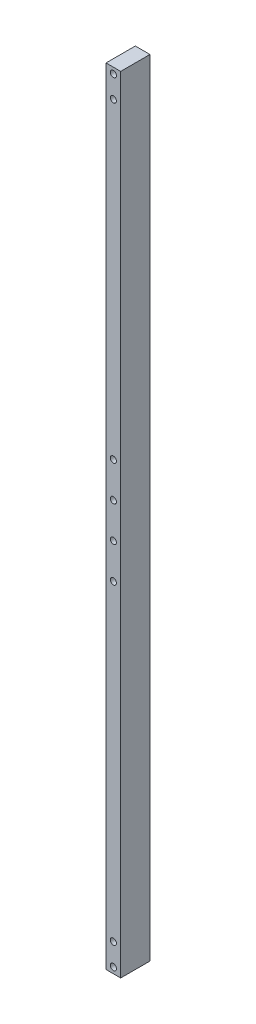
ISO-10303-21;
HEADER;
FILE_DESCRIPTION(('STEP AP214'),'2;1');
FILE_NAME('part.step','',(''),(''),'','','');
FILE_SCHEMA(('AUTOMOTIVE_DESIGN { 1 0 10303 214 1 1 1 1 }'));
ENDSEC;
DATA;
#1=APPLICATION_CONTEXT('core data for automotive mechanical design processes');
#2=APPLICATION_PROTOCOL_DEFINITION('international standard','automotive_design',2000,#1);
#3=PRODUCT_CONTEXT('',#1,'mechanical');
#4=PRODUCT('Part','Part','',(#3));
#5=PRODUCT_RELATED_PRODUCT_CATEGORY('part','',(#4));
#6=PRODUCT_DEFINITION_FORMATION('','',#4);
#7=PRODUCT_DEFINITION_CONTEXT('part definition',#1,'design');
#8=PRODUCT_DEFINITION('design','',#6,#7);
#9=PRODUCT_DEFINITION_SHAPE('','',#8);
#10=(LENGTH_UNIT() NAMED_UNIT(*) SI_UNIT(.MILLI.,.METRE.));
#11=(NAMED_UNIT(*) PLANE_ANGLE_UNIT() SI_UNIT($,.RADIAN.));
#12=(NAMED_UNIT(*) SI_UNIT($,.STERADIAN.) SOLID_ANGLE_UNIT());
#13=UNCERTAINTY_MEASURE_WITH_UNIT(LENGTH_MEASURE(1.E-05),#10,'distance_accuracy_value','');
#14=(GEOMETRIC_REPRESENTATION_CONTEXT(3) GLOBAL_UNCERTAINTY_ASSIGNED_CONTEXT((#13)) GLOBAL_UNIT_ASSIGNED_CONTEXT((#10,
#11,#12)) REPRESENTATION_CONTEXT('',''));
#15=CARTESIAN_POINT('',(0.,0.,0.));
#16=DIRECTION('',(0.,0.,1.));
#17=DIRECTION('',(1.,0.,0.));
#18=AXIS2_PLACEMENT_3D('',#15,#16,#17);
#19=CARTESIAN_POINT('',(-3.09278350515464,600.,-14.819587628866));
#20=DIRECTION('',(1.,0.,0.));
#21=DIRECTION('',(0.,0.,-1.));
#22=AXIS2_PLACEMENT_3D('',#19,#20,#21);
#23=PLANE('',#22);
#24=DIRECTION('',(0.,-1.,0.));
#25=VECTOR('',#24,1.);
#26=CARTESIAN_POINT('',(-3.09278350515464,600.,-14.819587628866));
#27=LINE('',#26,#25);
#28=CARTESIAN_POINT('',(-3.09278350515464,568.,-14.819587628866));
#29=VERTEX_POINT('',#28);
#30=CARTESIAN_POINT('',(-3.09278350515464,32.,-14.819587628866));
#31=VERTEX_POINT('',#30);
#32=EDGE_CURVE('E95',#29,#31,#27,.T.);
#33=ORIENTED_EDGE('',*,*,#32,.T.);
#34=DIRECTION('',(0.,0.,1.));
#35=VECTOR('',#34,1.);
#36=CARTESIAN_POINT('',(-3.09278350515464,32.,-14.819587628866));
#37=LINE('',#36,#35);
#38=CARTESIAN_POINT('',(-3.09278350515464,32.,5.18041237113402));
#39=VERTEX_POINT('',#38);
#40=EDGE_CURVE('E52',#31,#39,#37,.T.);
#41=ORIENTED_EDGE('',*,*,#40,.T.);
#42=DIRECTION('',(0.,-1.,0.));
#43=VECTOR('',#42,1.);
#44=CARTESIAN_POINT('',(-3.09278350515464,600.,5.18041237113402));
#45=LINE('',#44,#43);
#46=CARTESIAN_POINT('',(-3.09278350515464,568.,5.18041237113402));
#47=VERTEX_POINT('',#46);
#48=EDGE_CURVE('E11',#47,#39,#45,.T.);
#49=ORIENTED_EDGE('',*,*,#48,.F.);
#50=DIRECTION('',(0.,0.,1.));
#51=VECTOR('',#50,1.);
#52=CARTESIAN_POINT('',(-3.09278350515464,568.,-14.819587628866));
#53=LINE('',#52,#51);
#54=EDGE_CURVE('E282',#29,#47,#53,.T.);
#55=ORIENTED_EDGE('',*,*,#54,.F.);
#56=EDGE_LOOP('',(#33,#41,#49,#55));
#57=FACE_BOUND('',#56,.T.);
#58=ADVANCED_FACE('F36',(#57),#23,.F.);
#59=CARTESIAN_POINT('',(-3.09278350515464,600.,5.18041237113402));
#60=DIRECTION('',(0.,0.,-1.));
#61=DIRECTION('',(-1.,0.,0.));
#62=AXIS2_PLACEMENT_3D('',#59,#60,#61);
#63=PLANE('',#62);
#64=CARTESIAN_POINT('',(1.90721649484537,549.,5.18041237113402));
#65=DIRECTION('',(0.,0.,1.));
#66=DIRECTION('',(1.,0.,0.));
#67=AXIS2_PLACEMENT_3D('',#64,#65,#66);
#68=CIRCLE('',#67,2.10000000000005);
#69=CARTESIAN_POINT('',(4.00721649484541,549.,5.18041237113402));
#70=VERTEX_POINT('',#69);
#71=EDGE_CURVE('E293',#70,#70,#68,.T.);
#72=ORIENTED_EDGE('',*,*,#71,.F.);
#73=EDGE_LOOP('',(#72));
#74=FACE_BOUND('',#73,.T.);
#75=CARTESIAN_POINT('',(1.90721649484543,36.,5.18041237113402));
#76=DIRECTION('',(0.,0.,1.));
#77=DIRECTION('',(-1.,0.,0.));
#78=AXIS2_PLACEMENT_3D('',#75,#76,#77);
#79=CIRCLE('',#78,2.10000000000002);
#80=CARTESIAN_POINT('',(-0.192783505154585,36.,5.18041237113402));
#81=VERTEX_POINT('',#80);
#82=EDGE_CURVE('E292',#81,#81,#79,.T.);
#83=ORIENTED_EDGE('',*,*,#82,.F.);
#84=EDGE_LOOP('',(#83));
#85=FACE_BOUND('',#84,.T.);
#86=CARTESIAN_POINT('',(1.90721649484543,51.,5.18041237113402));
#87=DIRECTION('',(0.,0.,1.));
#88=DIRECTION('',(-1.,0.,0.));
#89=AXIS2_PLACEMENT_3D('',#86,#87,#88);
#90=CIRCLE('',#89,2.1);
#91=CARTESIAN_POINT('',(-0.192783505154569,51.,5.18041237113402));
#92=VERTEX_POINT('',#91);
#93=EDGE_CURVE('E289',#92,#92,#90,.T.);
#94=ORIENTED_EDGE('',*,*,#93,.F.);
#95=EDGE_LOOP('',(#94));
#96=FACE_BOUND('',#95,.T.);
#97=CARTESIAN_POINT('',(1.90721649484537,564.,5.18041237113402));
#98=DIRECTION('',(0.,0.,1.));
#99=DIRECTION('',(1.,0.,0.));
#100=AXIS2_PLACEMENT_3D('',#97,#98,#99);
#101=CIRCLE('',#100,2.10000000000006);
#102=CARTESIAN_POINT('',(4.00721649484542,564.,5.18041237113402));
#103=VERTEX_POINT('',#102);
#104=EDGE_CURVE('E103',#103,#103,#101,.T.);
#105=ORIENTED_EDGE('',*,*,#104,.F.);
#106=EDGE_LOOP('',(#105));
#107=FACE_BOUND('',#106,.T.);
#108=CARTESIAN_POINT('',(1.9072164948454,264.,5.18041237113402));
#109=DIRECTION('',(0.,0.,1.));
#110=DIRECTION('',(1.,0.,0.));
#111=AXIS2_PLACEMENT_3D('',#108,#109,#110);
#112=CIRCLE('',#111,2.09999999999999);
#113=CARTESIAN_POINT('',(4.0072164948454,264.,5.18041237113402));
#114=VERTEX_POINT('',#113);
#115=EDGE_CURVE('E128',#114,#114,#112,.T.);
#116=ORIENTED_EDGE('',*,*,#115,.F.);
#117=EDGE_LOOP('',(#116));
#118=FACE_BOUND('',#117,.T.);
#119=CARTESIAN_POINT('',(1.9072164948454,288.,5.18041237113402));
#120=DIRECTION('',(0.,0.,1.));
#121=DIRECTION('',(1.,0.,0.));
#122=AXIS2_PLACEMENT_3D('',#119,#120,#121);
#123=CIRCLE('',#122,2.1);
#124=CARTESIAN_POINT('',(4.0072164948454,288.,5.18041237113402));
#125=VERTEX_POINT('',#124);
#126=EDGE_CURVE('E140',#125,#125,#123,.T.);
#127=ORIENTED_EDGE('',*,*,#126,.F.);
#128=EDGE_LOOP('',(#127));
#129=FACE_BOUND('',#128,.T.);
#130=CARTESIAN_POINT('',(1.9072164948454,312.,5.18041237113402));
#131=DIRECTION('',(0.,0.,1.));
#132=DIRECTION('',(-1.,0.,0.));
#133=AXIS2_PLACEMENT_3D('',#130,#131,#132);
#134=CIRCLE('',#133,2.09999999999999);
#135=CARTESIAN_POINT('',(-0.192783505154593,312.,5.18041237113402));
#136=VERTEX_POINT('',#135);
#137=EDGE_CURVE('E119',#136,#136,#134,.T.);
#138=ORIENTED_EDGE('',*,*,#137,.F.);
#139=EDGE_LOOP('',(#138));
#140=FACE_BOUND('',#139,.T.);
#141=CARTESIAN_POINT('',(1.9072164948454,336.,5.18041237113402));
#142=DIRECTION('',(0.,0.,1.));
#143=DIRECTION('',(-1.,0.,0.));
#144=AXIS2_PLACEMENT_3D('',#141,#142,#143);
#145=CIRCLE('',#144,2.09999999999999);
#146=CARTESIAN_POINT('',(-0.19278350515459,336.,5.18041237113402));
#147=VERTEX_POINT('',#146);
#148=EDGE_CURVE('E110',#147,#147,#145,.T.);
#149=ORIENTED_EDGE('',*,*,#148,.F.);
#150=EDGE_LOOP('',(#149));
#151=FACE_BOUND('',#150,.T.);
#152=ORIENTED_EDGE('',*,*,#48,.T.);
#153=DIRECTION('',(-1.,0.,0.));
#154=VECTOR('',#153,1.);
#155=CARTESIAN_POINT('',(6.90721649484536,32.,5.18041237113402));
#156=LINE('',#155,#154);
#157=CARTESIAN_POINT('',(6.90721649484536,32.,5.18041237113402));
#158=VERTEX_POINT('',#157);
#159=EDGE_CURVE('E79',#158,#39,#156,.T.);
#160=ORIENTED_EDGE('',*,*,#159,.F.);
#161=DIRECTION('',(0.,-1.,0.));
#162=VECTOR('',#161,1.);
#163=CARTESIAN_POINT('',(6.90721649484536,600.,5.18041237113402));
#164=LINE('',#163,#162);
#165=CARTESIAN_POINT('',(6.90721649484536,568.,5.18041237113402));
#166=VERTEX_POINT('',#165);
#167=EDGE_CURVE('E44',#166,#158,#164,.T.);
#168=ORIENTED_EDGE('',*,*,#167,.F.);
#169=DIRECTION('',(1.,0.,0.));
#170=VECTOR('',#169,1.);
#171=CARTESIAN_POINT('',(6.90721649484536,568.,5.18041237113402));
#172=LINE('',#171,#170);
#173=EDGE_CURVE('E281',#47,#166,#172,.T.);
#174=ORIENTED_EDGE('',*,*,#173,.F.);
#175=EDGE_LOOP('',(#152,#160,#168,#174));
#176=FACE_BOUND('',#175,.T.);
#177=ADVANCED_FACE('F88',(#74,#85,#96,#107,#118,#129,#140,#151,#176),#63,.F.);
#178=CARTESIAN_POINT('',(6.90721649484536,600.,-14.819587628866));
#179=DIRECTION('',(-1.,0.,0.));
#180=DIRECTION('',(0.,0.,1.));
#181=AXIS2_PLACEMENT_3D('',#178,#179,#180);
#182=PLANE('',#181);
#183=ORIENTED_EDGE('',*,*,#167,.T.);
#184=DIRECTION('',(0.,0.,1.));
#185=VECTOR('',#184,1.);
#186=CARTESIAN_POINT('',(6.90721649484536,32.,-14.819587628866));
#187=LINE('',#186,#185);
#188=CARTESIAN_POINT('',(6.90721649484536,32.,-14.819587628866));
#189=VERTEX_POINT('',#188);
#190=EDGE_CURVE('E76',#189,#158,#187,.T.);
#191=ORIENTED_EDGE('',*,*,#190,.F.);
#192=DIRECTION('',(0.,-1.,0.));
#193=VECTOR('',#192,1.);
#194=CARTESIAN_POINT('',(6.90721649484536,600.,-14.819587628866));
#195=LINE('',#194,#193);
#196=CARTESIAN_POINT('',(6.90721649484536,568.,-14.819587628866));
#197=VERTEX_POINT('',#196);
#198=EDGE_CURVE('E93',#197,#189,#195,.T.);
#199=ORIENTED_EDGE('',*,*,#198,.F.);
#200=DIRECTION('',(0.,0.,1.));
#201=VECTOR('',#200,1.);
#202=CARTESIAN_POINT('',(6.90721649484536,568.,-14.819587628866));
#203=LINE('',#202,#201);
#204=EDGE_CURVE('E60',#197,#166,#203,.T.);
#205=ORIENTED_EDGE('',*,*,#204,.T.);
#206=EDGE_LOOP('',(#183,#191,#199,#205));
#207=FACE_BOUND('',#206,.T.);
#208=ADVANCED_FACE('F92',(#207),#182,.F.);
#209=CARTESIAN_POINT('',(-3.09278350515464,600.,-14.819587628866));
#210=DIRECTION('',(0.,0.,1.));
#211=DIRECTION('',(1.,0.,0.));
#212=AXIS2_PLACEMENT_3D('',#209,#210,#211);
#213=PLANE('',#212);
#214=CARTESIAN_POINT('',(1.90721649484537,549.,-14.819587628866));
#215=DIRECTION('',(0.,0.,1.));
#216=DIRECTION('',(1.,0.,0.));
#217=AXIS2_PLACEMENT_3D('',#214,#215,#216);
#218=CIRCLE('',#217,2.10000000000005);
#219=CARTESIAN_POINT('',(4.00721649484541,549.,-14.819587628866));
#220=VERTEX_POINT('',#219);
#221=EDGE_CURVE('E39',#220,#220,#218,.T.);
#222=ORIENTED_EDGE('',*,*,#221,.T.);
#223=EDGE_LOOP('',(#222));
#224=FACE_BOUND('',#223,.T.);
#225=CARTESIAN_POINT('',(1.90721649484543,36.,-14.819587628866));
#226=DIRECTION('',(0.,0.,1.));
#227=DIRECTION('',(1.,0.,0.));
#228=AXIS2_PLACEMENT_3D('',#225,#226,#227);
#229=CIRCLE('',#228,2.10000000000002);
#230=CARTESIAN_POINT('',(4.00721649484545,36.,-14.819587628866));
#231=VERTEX_POINT('',#230);
#232=EDGE_CURVE('E105',#231,#231,#229,.T.);
#233=ORIENTED_EDGE('',*,*,#232,.T.);
#234=EDGE_LOOP('',(#233));
#235=FACE_BOUND('',#234,.T.);
#236=CARTESIAN_POINT('',(1.90721649484543,51.,-14.819587628866));
#237=DIRECTION('',(0.,0.,1.));
#238=DIRECTION('',(1.,0.,0.));
#239=AXIS2_PLACEMENT_3D('',#236,#237,#238);
#240=CIRCLE('',#239,2.1);
#241=CARTESIAN_POINT('',(4.00721649484542,51.,-14.819587628866));
#242=VERTEX_POINT('',#241);
#243=EDGE_CURVE('E102',#242,#242,#240,.T.);
#244=ORIENTED_EDGE('',*,*,#243,.T.);
#245=EDGE_LOOP('',(#244));
#246=FACE_BOUND('',#245,.T.);
#247=CARTESIAN_POINT('',(1.90721649484537,564.,-14.819587628866));
#248=DIRECTION('',(0.,0.,1.));
#249=DIRECTION('',(1.,0.,0.));
#250=AXIS2_PLACEMENT_3D('',#247,#248,#249);
#251=CIRCLE('',#250,2.10000000000006);
#252=CARTESIAN_POINT('',(4.00721649484542,564.,-14.819587628866));
#253=VERTEX_POINT('',#252);
#254=EDGE_CURVE('E99',#253,#253,#251,.T.);
#255=ORIENTED_EDGE('',*,*,#254,.T.);
#256=EDGE_LOOP('',(#255));
#257=FACE_BOUND('',#256,.T.);
#258=CARTESIAN_POINT('',(1.9072164948454,264.,-14.819587628866));
#259=DIRECTION('',(0.,0.,1.));
#260=DIRECTION('',(1.,0.,0.));
#261=AXIS2_PLACEMENT_3D('',#258,#259,#260);
#262=CIRCLE('',#261,2.09999999999999);
#263=CARTESIAN_POINT('',(4.0072164948454,264.,-14.819587628866));
#264=VERTEX_POINT('',#263);
#265=EDGE_CURVE('E123',#264,#264,#262,.T.);
#266=ORIENTED_EDGE('',*,*,#265,.T.);
#267=EDGE_LOOP('',(#266));
#268=FACE_BOUND('',#267,.T.);
#269=CARTESIAN_POINT('',(1.9072164948454,288.,-14.819587628866));
#270=DIRECTION('',(0.,0.,1.));
#271=DIRECTION('',(1.,0.,0.));
#272=AXIS2_PLACEMENT_3D('',#269,#270,#271);
#273=CIRCLE('',#272,2.1);
#274=CARTESIAN_POINT('',(4.0072164948454,288.,-14.819587628866));
#275=VERTEX_POINT('',#274);
#276=EDGE_CURVE('E133',#275,#275,#273,.T.);
#277=ORIENTED_EDGE('',*,*,#276,.T.);
#278=EDGE_LOOP('',(#277));
#279=FACE_BOUND('',#278,.T.);
#280=CARTESIAN_POINT('',(1.9072164948454,312.,-14.819587628866));
#281=DIRECTION('',(0.,0.,1.));
#282=DIRECTION('',(-1.,0.,0.));
#283=AXIS2_PLACEMENT_3D('',#280,#281,#282);
#284=CIRCLE('',#283,2.09999999999999);
#285=CARTESIAN_POINT('',(-0.192783505154593,312.,-14.819587628866));
#286=VERTEX_POINT('',#285);
#287=EDGE_CURVE('E143',#286,#286,#284,.T.);
#288=ORIENTED_EDGE('',*,*,#287,.T.);
#289=EDGE_LOOP('',(#288));
#290=FACE_BOUND('',#289,.T.);
#291=CARTESIAN_POINT('',(1.9072164948454,336.,-14.819587628866));
#292=DIRECTION('',(0.,0.,1.));
#293=DIRECTION('',(-1.,0.,0.));
#294=AXIS2_PLACEMENT_3D('',#291,#292,#293);
#295=CIRCLE('',#294,2.09999999999999);
#296=CARTESIAN_POINT('',(-0.19278350515459,336.,-14.819587628866));
#297=VERTEX_POINT('',#296);
#298=EDGE_CURVE('E114',#297,#297,#295,.T.);
#299=ORIENTED_EDGE('',*,*,#298,.T.);
#300=EDGE_LOOP('',(#299));
#301=FACE_BOUND('',#300,.T.);
#302=ORIENTED_EDGE('',*,*,#198,.T.);
#303=DIRECTION('',(-1.,0.,0.));
#304=VECTOR('',#303,1.);
#305=CARTESIAN_POINT('',(6.90721649484536,32.,-14.819587628866));
#306=LINE('',#305,#304);
#307=EDGE_CURVE('E80',#189,#31,#306,.T.);
#308=ORIENTED_EDGE('',*,*,#307,.T.);
#309=ORIENTED_EDGE('',*,*,#32,.F.);
#310=DIRECTION('',(1.,0.,0.));
#311=VECTOR('',#310,1.);
#312=CARTESIAN_POINT('',(6.90721649484536,568.,-14.819587628866));
#313=LINE('',#312,#311);
#314=EDGE_CURVE('E283',#29,#197,#313,.T.);
#315=ORIENTED_EDGE('',*,*,#314,.T.);
#316=EDGE_LOOP('',(#302,#308,#309,#315));
#317=FACE_BOUND('',#316,.T.);
#318=ADVANCED_FACE('F157',(#224,#235,#246,#257,#268,#279,#290,#301,#317),#213,.F.);
#319=CARTESIAN_POINT('',(1.9072164948454,336.,-14.819587628866));
#320=DIRECTION('',(0.,0.,1.));
#321=DIRECTION('',(1.,0.,0.));
#322=AXIS2_PLACEMENT_3D('',#319,#320,#321);
#323=CYLINDRICAL_SURFACE('',#322,2.09999999999999);
#324=ORIENTED_EDGE('',*,*,#298,.F.);
#325=EDGE_LOOP('',(#324));
#326=FACE_BOUND('',#325,.T.);
#327=ORIENTED_EDGE('',*,*,#148,.T.);
#328=EDGE_LOOP('',(#327));
#329=FACE_BOUND('',#328,.T.);
#330=ADVANCED_FACE('F164',(#326,#329),#323,.F.);
#331=CARTESIAN_POINT('',(1.9072164948454,312.,-14.819587628866));
#332=DIRECTION('',(0.,0.,1.));
#333=DIRECTION('',(1.,0.,0.));
#334=AXIS2_PLACEMENT_3D('',#331,#332,#333);
#335=CYLINDRICAL_SURFACE('',#334,2.09999999999999);
#336=ORIENTED_EDGE('',*,*,#287,.F.);
#337=EDGE_LOOP('',(#336));
#338=FACE_BOUND('',#337,.T.);
#339=ORIENTED_EDGE('',*,*,#137,.T.);
#340=EDGE_LOOP('',(#339));
#341=FACE_BOUND('',#340,.T.);
#342=ADVANCED_FACE('F148',(#338,#341),#335,.F.);
#343=CARTESIAN_POINT('',(1.9072164948454,288.,-14.819587628866));
#344=DIRECTION('',(0.,0.,1.));
#345=DIRECTION('',(1.,0.,0.));
#346=AXIS2_PLACEMENT_3D('',#343,#344,#345);
#347=CYLINDRICAL_SURFACE('',#346,2.1);
#348=ORIENTED_EDGE('',*,*,#276,.F.);
#349=EDGE_LOOP('',(#348));
#350=FACE_BOUND('',#349,.T.);
#351=ORIENTED_EDGE('',*,*,#126,.T.);
#352=EDGE_LOOP('',(#351));
#353=FACE_BOUND('',#352,.T.);
#354=ADVANCED_FACE('F170',(#350,#353),#347,.F.);
#355=CARTESIAN_POINT('',(1.9072164948454,264.,-14.819587628866));
#356=DIRECTION('',(0.,0.,1.));
#357=DIRECTION('',(1.,0.,0.));
#358=AXIS2_PLACEMENT_3D('',#355,#356,#357);
#359=CYLINDRICAL_SURFACE('',#358,2.09999999999999);
#360=ORIENTED_EDGE('',*,*,#265,.F.);
#361=EDGE_LOOP('',(#360));
#362=FACE_BOUND('',#361,.T.);
#363=ORIENTED_EDGE('',*,*,#115,.T.);
#364=EDGE_LOOP('',(#363));
#365=FACE_BOUND('',#364,.T.);
#366=ADVANCED_FACE('F174',(#362,#365),#359,.F.);
#367=CARTESIAN_POINT('',(1.90721649484537,564.,-48.819587628866));
#368=DIRECTION('',(0.,0.,1.));
#369=DIRECTION('',(1.,0.,0.));
#370=AXIS2_PLACEMENT_3D('',#367,#368,#369);
#371=CYLINDRICAL_SURFACE('',#370,2.10000000000006);
#372=ORIENTED_EDGE('',*,*,#104,.T.);
#373=EDGE_LOOP('',(#372));
#374=FACE_BOUND('',#373,.T.);
#375=ORIENTED_EDGE('',*,*,#254,.F.);
#376=EDGE_LOOP('',(#375));
#377=FACE_BOUND('',#376,.T.);
#378=ADVANCED_FACE('F178',(#374,#377),#371,.F.);
#379=CARTESIAN_POINT('',(1.90721649484543,51.,-48.819587628866));
#380=DIRECTION('',(0.,0.,1.));
#381=DIRECTION('',(1.,0.,0.));
#382=AXIS2_PLACEMENT_3D('',#379,#380,#381);
#383=CYLINDRICAL_SURFACE('',#382,2.1);
#384=ORIENTED_EDGE('',*,*,#93,.T.);
#385=EDGE_LOOP('',(#384));
#386=FACE_BOUND('',#385,.T.);
#387=ORIENTED_EDGE('',*,*,#243,.F.);
#388=EDGE_LOOP('',(#387));
#389=FACE_BOUND('',#388,.T.);
#390=ADVANCED_FACE('F182',(#386,#389),#383,.F.);
#391=CARTESIAN_POINT('',(1.90721649484543,36.,-48.819587628866));
#392=DIRECTION('',(0.,0.,1.));
#393=DIRECTION('',(1.,0.,0.));
#394=AXIS2_PLACEMENT_3D('',#391,#392,#393);
#395=CYLINDRICAL_SURFACE('',#394,2.10000000000002);
#396=ORIENTED_EDGE('',*,*,#82,.T.);
#397=EDGE_LOOP('',(#396));
#398=FACE_BOUND('',#397,.T.);
#399=ORIENTED_EDGE('',*,*,#232,.F.);
#400=EDGE_LOOP('',(#399));
#401=FACE_BOUND('',#400,.T.);
#402=ADVANCED_FACE('F184',(#398,#401),#395,.F.);
#403=CARTESIAN_POINT('',(1.90721649484537,549.,-48.819587628866));
#404=DIRECTION('',(0.,0.,1.));
#405=DIRECTION('',(1.,0.,0.));
#406=AXIS2_PLACEMENT_3D('',#403,#404,#405);
#407=CYLINDRICAL_SURFACE('',#406,2.10000000000005);
#408=ORIENTED_EDGE('',*,*,#71,.T.);
#409=EDGE_LOOP('',(#408));
#410=FACE_BOUND('',#409,.T.);
#411=ORIENTED_EDGE('',*,*,#221,.F.);
#412=EDGE_LOOP('',(#411));
#413=FACE_BOUND('',#412,.T.);
#414=ADVANCED_FACE('F187',(#410,#413),#407,.F.);
#415=CARTESIAN_POINT('',(6.90721649484536,568.,-14.819587628866));
#416=DIRECTION('',(0.,-1.,0.));
#417=DIRECTION('',(0.,0.,-1.));
#418=AXIS2_PLACEMENT_3D('',#415,#416,#417);
#419=PLANE('',#418);
#420=ORIENTED_EDGE('',*,*,#173,.T.);
#421=ORIENTED_EDGE('',*,*,#204,.F.);
#422=ORIENTED_EDGE('',*,*,#314,.F.);
#423=ORIENTED_EDGE('',*,*,#54,.T.);
#424=EDGE_LOOP('',(#420,#421,#422,#423));
#425=FACE_BOUND('',#424,.T.);
#426=ADVANCED_FACE('F191',(#425),#419,.F.);
#427=CARTESIAN_POINT('',(6.90721649484536,32.,-14.819587628866));
#428=DIRECTION('',(0.,1.,0.));
#429=DIRECTION('',(0.,0.,1.));
#430=AXIS2_PLACEMENT_3D('',#427,#428,#429);
#431=PLANE('',#430);
#432=ORIENTED_EDGE('',*,*,#159,.T.);
#433=ORIENTED_EDGE('',*,*,#40,.F.);
#434=ORIENTED_EDGE('',*,*,#307,.F.);
#435=ORIENTED_EDGE('',*,*,#190,.T.);
#436=EDGE_LOOP('',(#432,#433,#434,#435));
#437=FACE_BOUND('',#436,.T.);
#438=ADVANCED_FACE('F78',(#437),#431,.F.);
#439=CLOSED_SHELL('',(#58,#177,#208,#318,#330,#342,#354,#366,#378,#390,#402,#414,#426,#438));
#440=MANIFOLD_SOLID_BREP('B2',#439);
#441=ADVANCED_BREP_SHAPE_REPRESENTATION('',(#18,#440),#14);
#442=SHAPE_DEFINITION_REPRESENTATION(#9,#441);
ENDSEC;
END-ISO-10303-21;
